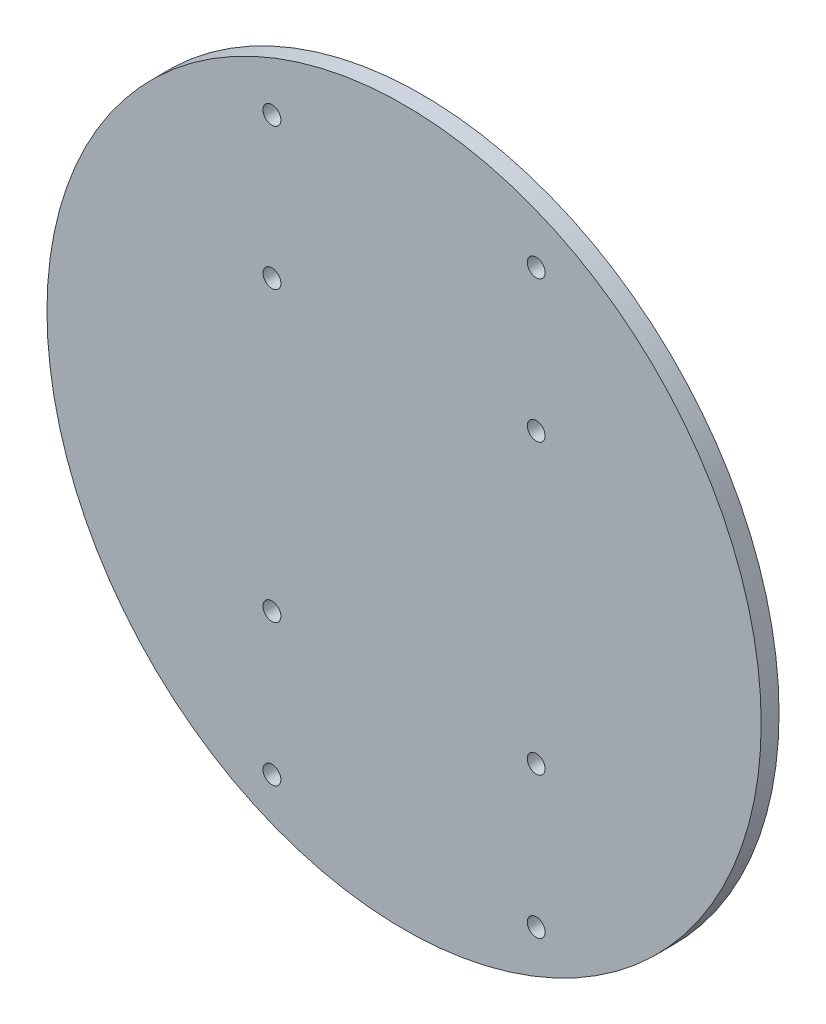
ISO-10303-21;
HEADER;
FILE_DESCRIPTION(('STEP AP214'),'2;1');
FILE_NAME('part.step','',(''),(''),'','','');
FILE_SCHEMA(('AUTOMOTIVE_DESIGN { 1 0 10303 214 1 1 1 1 }'));
ENDSEC;
DATA;
#1=APPLICATION_CONTEXT('core data for automotive mechanical design processes');
#2=APPLICATION_PROTOCOL_DEFINITION('international standard','automotive_design',2000,#1);
#3=PRODUCT_CONTEXT('',#1,'mechanical');
#4=PRODUCT('Part','Part','',(#3));
#5=PRODUCT_RELATED_PRODUCT_CATEGORY('part','',(#4));
#6=PRODUCT_DEFINITION_FORMATION('','',#4);
#7=PRODUCT_DEFINITION_CONTEXT('part definition',#1,'design');
#8=PRODUCT_DEFINITION('design','',#6,#7);
#9=PRODUCT_DEFINITION_SHAPE('','',#8);
#10=(LENGTH_UNIT() NAMED_UNIT(*) SI_UNIT(.MILLI.,.METRE.));
#11=(NAMED_UNIT(*) PLANE_ANGLE_UNIT() SI_UNIT($,.RADIAN.));
#12=(NAMED_UNIT(*) SI_UNIT($,.STERADIAN.) SOLID_ANGLE_UNIT());
#13=UNCERTAINTY_MEASURE_WITH_UNIT(LENGTH_MEASURE(1.E-05),#10,'distance_accuracy_value','');
#14=(GEOMETRIC_REPRESENTATION_CONTEXT(3) GLOBAL_UNCERTAINTY_ASSIGNED_CONTEXT((#13)) GLOBAL_UNIT_ASSIGNED_CONTEXT((#10,
#11,#12)) REPRESENTATION_CONTEXT('',''));
#15=CARTESIAN_POINT('',(0.,0.,0.));
#16=DIRECTION('',(0.,0.,1.));
#17=DIRECTION('',(1.,0.,0.));
#18=AXIS2_PLACEMENT_3D('',#15,#16,#17);
#19=CARTESIAN_POINT('',(0.,0.,5.));
#20=DIRECTION('',(0.,0.,1.));
#21=DIRECTION('',(1.,0.,0.));
#22=AXIS2_PLACEMENT_3D('',#19,#20,#21);
#23=PLANE('',#22);
#24=CARTESIAN_POINT('',(-37.,79.0468245967879,5.));
#25=DIRECTION('',(0.,0.,1.));
#26=DIRECTION('',(1.,0.,0.));
#27=AXIS2_PLACEMENT_3D('',#24,#25,#26);
#28=CIRCLE('',#27,2.5);
#29=CARTESIAN_POINT('',(-34.5,79.0468245967879,5.));
#30=VERTEX_POINT('',#29);
#31=EDGE_CURVE('E185',#30,#30,#28,.T.);
#32=ORIENTED_EDGE('',*,*,#31,.F.);
#33=EDGE_LOOP('',(#32));
#34=FACE_BOUND('',#33,.T.);
#35=CARTESIAN_POINT('',(-37.,39.4468245967879,5.));
#36=DIRECTION('',(0.,0.,1.));
#37=DIRECTION('',(1.,0.,0.));
#38=AXIS2_PLACEMENT_3D('',#35,#36,#37);
#39=CIRCLE('',#38,2.5);
#40=CARTESIAN_POINT('',(-34.5,39.4468245967879,5.));
#41=VERTEX_POINT('',#40);
#42=EDGE_CURVE('E85',#41,#41,#39,.T.);
#43=ORIENTED_EDGE('',*,*,#42,.F.);
#44=EDGE_LOOP('',(#43));
#45=FACE_BOUND('',#44,.T.);
#46=CARTESIAN_POINT('',(37.,79.0468245967879,5.));
#47=DIRECTION('',(0.,0.,1.));
#48=DIRECTION('',(1.,0.,0.));
#49=AXIS2_PLACEMENT_3D('',#46,#47,#48);
#50=CIRCLE('',#49,2.5);
#51=CARTESIAN_POINT('',(39.5,79.0468245967879,5.));
#52=VERTEX_POINT('',#51);
#53=EDGE_CURVE('E166',#52,#52,#50,.T.);
#54=ORIENTED_EDGE('',*,*,#53,.F.);
#55=EDGE_LOOP('',(#54));
#56=FACE_BOUND('',#55,.T.);
#57=CARTESIAN_POINT('',(37.,39.4468245967879,5.));
#58=DIRECTION('',(0.,0.,1.));
#59=DIRECTION('',(1.,0.,0.));
#60=AXIS2_PLACEMENT_3D('',#57,#58,#59);
#61=CIRCLE('',#60,2.5);
#62=CARTESIAN_POINT('',(39.5,39.4468245967879,5.));
#63=VERTEX_POINT('',#62);
#64=EDGE_CURVE('E186',#63,#63,#61,.T.);
#65=ORIENTED_EDGE('',*,*,#64,.F.);
#66=EDGE_LOOP('',(#65));
#67=FACE_BOUND('',#66,.T.);
#68=CARTESIAN_POINT('',(37.,-80.9031754032122,5.));
#69=DIRECTION('',(0.,0.,1.));
#70=DIRECTION('',(1.,0.,0.));
#71=AXIS2_PLACEMENT_3D('',#68,#69,#70);
#72=CIRCLE('',#71,2.5);
#73=CARTESIAN_POINT('',(39.5,-80.9031754032122,5.));
#74=VERTEX_POINT('',#73);
#75=EDGE_CURVE('E106',#74,#74,#72,.T.);
#76=ORIENTED_EDGE('',*,*,#75,.F.);
#77=EDGE_LOOP('',(#76));
#78=FACE_BOUND('',#77,.T.);
#79=CARTESIAN_POINT('',(-37.,-41.3031754032122,5.));
#80=DIRECTION('',(0.,0.,1.));
#81=DIRECTION('',(1.,0.,0.));
#82=AXIS2_PLACEMENT_3D('',#79,#80,#81);
#83=CIRCLE('',#82,2.5);
#84=CARTESIAN_POINT('',(-34.5,-41.3031754032122,5.));
#85=VERTEX_POINT('',#84);
#86=EDGE_CURVE('E100',#85,#85,#83,.T.);
#87=ORIENTED_EDGE('',*,*,#86,.F.);
#88=EDGE_LOOP('',(#87));
#89=FACE_BOUND('',#88,.T.);
#90=CARTESIAN_POINT('',(37.,-41.3031754032121,5.));
#91=DIRECTION('',(0.,0.,1.));
#92=DIRECTION('',(1.,0.,0.));
#93=AXIS2_PLACEMENT_3D('',#90,#91,#92);
#94=CIRCLE('',#93,2.5);
#95=CARTESIAN_POINT('',(39.5,-41.3031754032121,5.));
#96=VERTEX_POINT('',#95);
#97=EDGE_CURVE('E95',#96,#96,#94,.T.);
#98=ORIENTED_EDGE('',*,*,#97,.F.);
#99=EDGE_LOOP('',(#98));
#100=FACE_BOUND('',#99,.T.);
#101=CARTESIAN_POINT('',(-37.,-80.9031754032121,5.));
#102=DIRECTION('',(0.,0.,1.));
#103=DIRECTION('',(1.,0.,0.));
#104=AXIS2_PLACEMENT_3D('',#101,#102,#103);
#105=CIRCLE('',#104,2.5);
#106=CARTESIAN_POINT('',(-34.5,-80.9031754032121,5.));
#107=VERTEX_POINT('',#106);
#108=EDGE_CURVE('E69',#107,#107,#105,.T.);
#109=ORIENTED_EDGE('',*,*,#108,.F.);
#110=EDGE_LOOP('',(#109));
#111=FACE_BOUND('',#110,.T.);
#112=CARTESIAN_POINT('',(0.,0.,5.));
#113=DIRECTION('',(0.,0.,1.));
#114=DIRECTION('',(1.,0.,0.));
#115=AXIS2_PLACEMENT_3D('',#112,#113,#114);
#116=CIRCLE('',#115,100.);
#117=CARTESIAN_POINT('',(100.,0.,5.));
#118=VERTEX_POINT('',#117);
#119=EDGE_CURVE('E54',#118,#118,#116,.T.);
#120=ORIENTED_EDGE('',*,*,#119,.T.);
#121=EDGE_LOOP('',(#120));
#122=FACE_BOUND('',#121,.T.);
#123=ADVANCED_FACE('F45',(#34,#45,#56,#67,#78,#89,#100,#111,#122),#23,.T.);
#124=CARTESIAN_POINT('',(0.,0.,-282.842712474619));
#125=DIRECTION('',(0.,0.,1.));
#126=DIRECTION('',(1.,0.,0.));
#127=AXIS2_PLACEMENT_3D('',#124,#125,#126);
#128=CYLINDRICAL_SURFACE('',#127,100.);
#129=CARTESIAN_POINT('',(0.,0.,0.));
#130=DIRECTION('',(0.,0.,1.));
#131=DIRECTION('',(1.,0.,0.));
#132=AXIS2_PLACEMENT_3D('',#129,#130,#131);
#133=CIRCLE('',#132,100.);
#134=CARTESIAN_POINT('',(100.,0.,0.));
#135=VERTEX_POINT('',#134);
#136=EDGE_CURVE('E10',#135,#135,#133,.F.);
#137=ORIENTED_EDGE('',*,*,#136,.F.);
#138=EDGE_LOOP('',(#137));
#139=FACE_BOUND('',#138,.T.);
#140=ORIENTED_EDGE('',*,*,#119,.F.);
#141=EDGE_LOOP('',(#140));
#142=FACE_BOUND('',#141,.T.);
#143=ADVANCED_FACE('F122',(#139,#142),#128,.T.);
#144=CARTESIAN_POINT('',(0.,0.,0.));
#145=DIRECTION('',(0.,0.,1.));
#146=DIRECTION('',(1.,0.,0.));
#147=AXIS2_PLACEMENT_3D('',#144,#145,#146);
#148=PLANE('',#147);
#149=CARTESIAN_POINT('',(-37.,79.0468245967879,0.));
#150=DIRECTION('',(0.,0.,1.));
#151=DIRECTION('',(1.,0.,0.));
#152=AXIS2_PLACEMENT_3D('',#149,#150,#151);
#153=CIRCLE('',#152,2.5);
#154=CARTESIAN_POINT('',(-34.5,79.0468245967879,0.));
#155=VERTEX_POINT('',#154);
#156=EDGE_CURVE('E49',#155,#155,#153,.T.);
#157=ORIENTED_EDGE('',*,*,#156,.T.);
#158=EDGE_LOOP('',(#157));
#159=FACE_BOUND('',#158,.T.);
#160=CARTESIAN_POINT('',(-37.,39.4468245967879,0.));
#161=DIRECTION('',(0.,0.,1.));
#162=DIRECTION('',(1.,0.,0.));
#163=AXIS2_PLACEMENT_3D('',#160,#161,#162);
#164=CIRCLE('',#163,2.5);
#165=CARTESIAN_POINT('',(-34.5,39.4468245967879,0.));
#166=VERTEX_POINT('',#165);
#167=EDGE_CURVE('E88',#166,#166,#164,.T.);
#168=ORIENTED_EDGE('',*,*,#167,.T.);
#169=EDGE_LOOP('',(#168));
#170=FACE_BOUND('',#169,.T.);
#171=CARTESIAN_POINT('',(37.,79.0468245967879,0.));
#172=DIRECTION('',(0.,0.,1.));
#173=DIRECTION('',(1.,0.,0.));
#174=AXIS2_PLACEMENT_3D('',#171,#172,#173);
#175=CIRCLE('',#174,2.5);
#176=CARTESIAN_POINT('',(39.5,79.0468245967879,0.));
#177=VERTEX_POINT('',#176);
#178=EDGE_CURVE('E84',#177,#177,#175,.T.);
#179=ORIENTED_EDGE('',*,*,#178,.T.);
#180=EDGE_LOOP('',(#179));
#181=FACE_BOUND('',#180,.T.);
#182=CARTESIAN_POINT('',(37.,39.4468245967879,0.));
#183=DIRECTION('',(0.,0.,1.));
#184=DIRECTION('',(1.,0.,0.));
#185=AXIS2_PLACEMENT_3D('',#182,#183,#184);
#186=CIRCLE('',#185,2.5);
#187=CARTESIAN_POINT('',(39.5,39.4468245967879,0.));
#188=VERTEX_POINT('',#187);
#189=EDGE_CURVE('E80',#188,#188,#186,.T.);
#190=ORIENTED_EDGE('',*,*,#189,.T.);
#191=EDGE_LOOP('',(#190));
#192=FACE_BOUND('',#191,.T.);
#193=CARTESIAN_POINT('',(37.,-80.9031754032122,0.));
#194=DIRECTION('',(0.,0.,1.));
#195=DIRECTION('',(1.,0.,0.));
#196=AXIS2_PLACEMENT_3D('',#193,#194,#195);
#197=CIRCLE('',#196,2.5);
#198=CARTESIAN_POINT('',(39.5,-80.9031754032122,0.));
#199=VERTEX_POINT('',#198);
#200=EDGE_CURVE('E60',#199,#199,#197,.T.);
#201=ORIENTED_EDGE('',*,*,#200,.T.);
#202=EDGE_LOOP('',(#201));
#203=FACE_BOUND('',#202,.T.);
#204=CARTESIAN_POINT('',(-37.,-41.3031754032122,0.));
#205=DIRECTION('',(0.,0.,1.));
#206=DIRECTION('',(1.,0.,0.));
#207=AXIS2_PLACEMENT_3D('',#204,#205,#206);
#208=CIRCLE('',#207,2.5);
#209=CARTESIAN_POINT('',(-34.5,-41.3031754032122,0.));
#210=VERTEX_POINT('',#209);
#211=EDGE_CURVE('E73',#210,#210,#208,.T.);
#212=ORIENTED_EDGE('',*,*,#211,.T.);
#213=EDGE_LOOP('',(#212));
#214=FACE_BOUND('',#213,.T.);
#215=CARTESIAN_POINT('',(37.,-41.3031754032121,0.));
#216=DIRECTION('',(0.,0.,1.));
#217=DIRECTION('',(1.,0.,0.));
#218=AXIS2_PLACEMENT_3D('',#215,#216,#217);
#219=CIRCLE('',#218,2.5);
#220=CARTESIAN_POINT('',(39.5,-41.3031754032121,0.));
#221=VERTEX_POINT('',#220);
#222=EDGE_CURVE('E68',#221,#221,#219,.T.);
#223=ORIENTED_EDGE('',*,*,#222,.T.);
#224=EDGE_LOOP('',(#223));
#225=FACE_BOUND('',#224,.T.);
#226=CARTESIAN_POINT('',(-37.,-80.9031754032121,0.));
#227=DIRECTION('',(0.,0.,1.));
#228=DIRECTION('',(1.,0.,0.));
#229=AXIS2_PLACEMENT_3D('',#226,#227,#228);
#230=CIRCLE('',#229,2.5);
#231=CARTESIAN_POINT('',(-34.5,-80.9031754032121,0.));
#232=VERTEX_POINT('',#231);
#233=EDGE_CURVE('E64',#232,#232,#230,.T.);
#234=ORIENTED_EDGE('',*,*,#233,.T.);
#235=EDGE_LOOP('',(#234));
#236=FACE_BOUND('',#235,.T.);
#237=ORIENTED_EDGE('',*,*,#136,.T.);
#238=EDGE_LOOP('',(#237));
#239=FACE_BOUND('',#238,.T.);
#240=ADVANCED_FACE('F47',(#159,#170,#181,#192,#203,#214,#225,#236,#239),#148,.F.);
#241=CARTESIAN_POINT('',(-37.,-80.9031754032121,-5.));
#242=DIRECTION('',(0.,0.,1.));
#243=DIRECTION('',(1.,0.,0.));
#244=AXIS2_PLACEMENT_3D('',#241,#242,#243);
#245=CYLINDRICAL_SURFACE('',#244,2.5);
#246=ORIENTED_EDGE('',*,*,#108,.T.);
#247=EDGE_LOOP('',(#246));
#248=FACE_BOUND('',#247,.T.);
#249=ORIENTED_EDGE('',*,*,#233,.F.);
#250=EDGE_LOOP('',(#249));
#251=FACE_BOUND('',#250,.T.);
#252=ADVANCED_FACE('F117',(#248,#251),#245,.F.);
#253=CARTESIAN_POINT('',(37.,-41.3031754032121,-5.));
#254=DIRECTION('',(0.,0.,1.));
#255=DIRECTION('',(1.,0.,0.));
#256=AXIS2_PLACEMENT_3D('',#253,#254,#255);
#257=CYLINDRICAL_SURFACE('',#256,2.5);
#258=ORIENTED_EDGE('',*,*,#97,.T.);
#259=EDGE_LOOP('',(#258));
#260=FACE_BOUND('',#259,.T.);
#261=ORIENTED_EDGE('',*,*,#222,.F.);
#262=EDGE_LOOP('',(#261));
#263=FACE_BOUND('',#262,.T.);
#264=ADVANCED_FACE('F135',(#260,#263),#257,.F.);
#265=CARTESIAN_POINT('',(-37.,-41.3031754032122,-5.));
#266=DIRECTION('',(0.,0.,1.));
#267=DIRECTION('',(1.,0.,0.));
#268=AXIS2_PLACEMENT_3D('',#265,#266,#267);
#269=CYLINDRICAL_SURFACE('',#268,2.5);
#270=ORIENTED_EDGE('',*,*,#86,.T.);
#271=EDGE_LOOP('',(#270));
#272=FACE_BOUND('',#271,.T.);
#273=ORIENTED_EDGE('',*,*,#211,.F.);
#274=EDGE_LOOP('',(#273));
#275=FACE_BOUND('',#274,.T.);
#276=ADVANCED_FACE('F136',(#272,#275),#269,.F.);
#277=CARTESIAN_POINT('',(37.,-80.9031754032122,-5.));
#278=DIRECTION('',(0.,0.,1.));
#279=DIRECTION('',(1.,0.,0.));
#280=AXIS2_PLACEMENT_3D('',#277,#278,#279);
#281=CYLINDRICAL_SURFACE('',#280,2.5);
#282=ORIENTED_EDGE('',*,*,#75,.T.);
#283=EDGE_LOOP('',(#282));
#284=FACE_BOUND('',#283,.T.);
#285=ORIENTED_EDGE('',*,*,#200,.F.);
#286=EDGE_LOOP('',(#285));
#287=FACE_BOUND('',#286,.T.);
#288=ADVANCED_FACE('F139',(#284,#287),#281,.F.);
#289=CARTESIAN_POINT('',(37.,39.4468245967879,-5.));
#290=DIRECTION('',(0.,0.,1.));
#291=DIRECTION('',(1.,0.,0.));
#292=AXIS2_PLACEMENT_3D('',#289,#290,#291);
#293=CYLINDRICAL_SURFACE('',#292,2.5);
#294=ORIENTED_EDGE('',*,*,#64,.T.);
#295=EDGE_LOOP('',(#294));
#296=FACE_BOUND('',#295,.T.);
#297=ORIENTED_EDGE('',*,*,#189,.F.);
#298=EDGE_LOOP('',(#297));
#299=FACE_BOUND('',#298,.T.);
#300=ADVANCED_FACE('F143',(#296,#299),#293,.F.);
#301=CARTESIAN_POINT('',(37.,79.0468245967879,-5.));
#302=DIRECTION('',(0.,0.,1.));
#303=DIRECTION('',(1.,0.,0.));
#304=AXIS2_PLACEMENT_3D('',#301,#302,#303);
#305=CYLINDRICAL_SURFACE('',#304,2.5);
#306=ORIENTED_EDGE('',*,*,#53,.T.);
#307=EDGE_LOOP('',(#306));
#308=FACE_BOUND('',#307,.T.);
#309=ORIENTED_EDGE('',*,*,#178,.F.);
#310=EDGE_LOOP('',(#309));
#311=FACE_BOUND('',#310,.T.);
#312=ADVANCED_FACE('F151',(#308,#311),#305,.F.);
#313=CARTESIAN_POINT('',(-37.,39.4468245967879,-5.));
#314=DIRECTION('',(0.,0.,1.));
#315=DIRECTION('',(1.,0.,0.));
#316=AXIS2_PLACEMENT_3D('',#313,#314,#315);
#317=CYLINDRICAL_SURFACE('',#316,2.5);
#318=ORIENTED_EDGE('',*,*,#42,.T.);
#319=EDGE_LOOP('',(#318));
#320=FACE_BOUND('',#319,.T.);
#321=ORIENTED_EDGE('',*,*,#167,.F.);
#322=EDGE_LOOP('',(#321));
#323=FACE_BOUND('',#322,.T.);
#324=ADVANCED_FACE('F147',(#320,#323),#317,.F.);
#325=CARTESIAN_POINT('',(-37.,79.0468245967879,-5.));
#326=DIRECTION('',(0.,0.,1.));
#327=DIRECTION('',(1.,0.,0.));
#328=AXIS2_PLACEMENT_3D('',#325,#326,#327);
#329=CYLINDRICAL_SURFACE('',#328,2.5);
#330=ORIENTED_EDGE('',*,*,#31,.T.);
#331=EDGE_LOOP('',(#330));
#332=FACE_BOUND('',#331,.T.);
#333=ORIENTED_EDGE('',*,*,#156,.F.);
#334=EDGE_LOOP('',(#333));
#335=FACE_BOUND('',#334,.T.);
#336=ADVANCED_FACE('F150',(#332,#335),#329,.F.);
#337=CLOSED_SHELL('',(#123,#143,#240,#252,#264,#276,#288,#300,#312,#324,#336));
#338=MANIFOLD_SOLID_BREP('B2',#337);
#339=ADVANCED_BREP_SHAPE_REPRESENTATION('',(#18,#338),#14);
#340=SHAPE_DEFINITION_REPRESENTATION(#9,#339);
ENDSEC;
END-ISO-10303-21;
